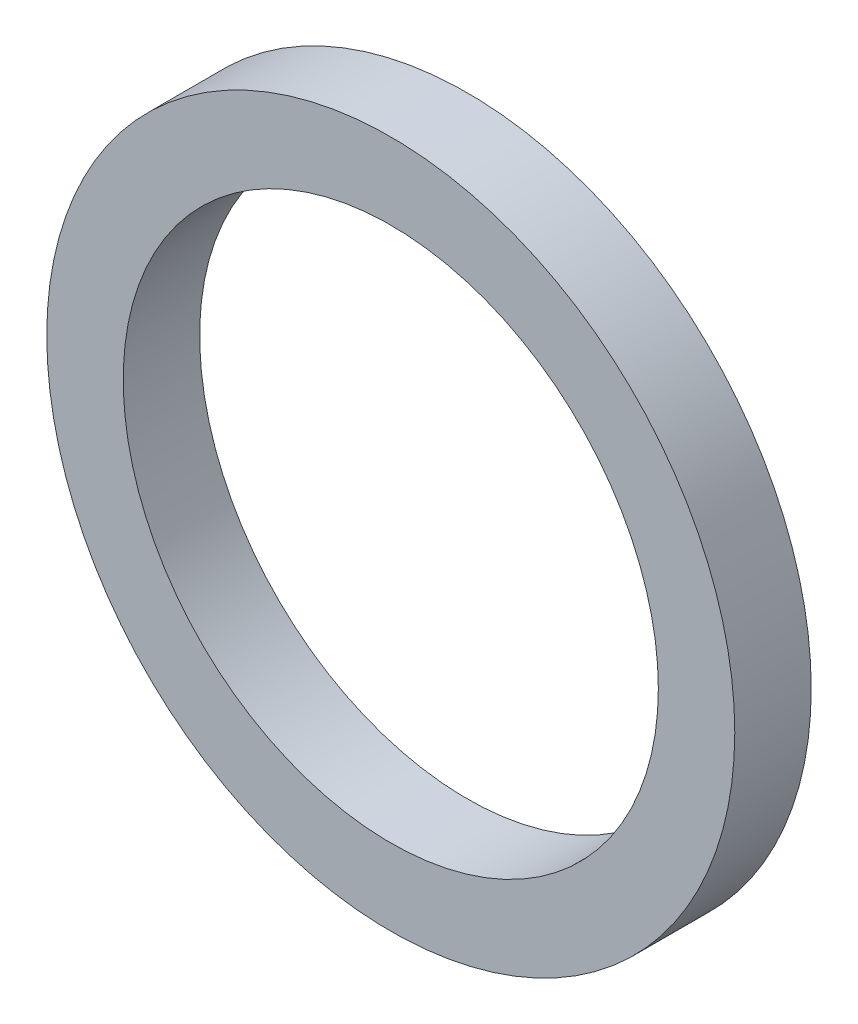
ISO-10303-21;
HEADER;
FILE_DESCRIPTION(('STEP AP214'),'2;1');
FILE_NAME('part.step','',(''),(''),'','','');
FILE_SCHEMA(('AUTOMOTIVE_DESIGN { 1 0 10303 214 1 1 1 1 }'));
ENDSEC;
DATA;
#1=APPLICATION_CONTEXT('core data for automotive mechanical design processes');
#2=APPLICATION_PROTOCOL_DEFINITION('international standard','automotive_design',2000,#1);
#3=PRODUCT_CONTEXT('',#1,'mechanical');
#4=PRODUCT('Part','Part','',(#3));
#5=PRODUCT_RELATED_PRODUCT_CATEGORY('part','',(#4));
#6=PRODUCT_DEFINITION_FORMATION('','',#4);
#7=PRODUCT_DEFINITION_CONTEXT('part definition',#1,'design');
#8=PRODUCT_DEFINITION('design','',#6,#7);
#9=PRODUCT_DEFINITION_SHAPE('','',#8);
#10=(LENGTH_UNIT() NAMED_UNIT(*) SI_UNIT(.MILLI.,.METRE.));
#11=(NAMED_UNIT(*) PLANE_ANGLE_UNIT() SI_UNIT($,.RADIAN.));
#12=(NAMED_UNIT(*) SI_UNIT($,.STERADIAN.) SOLID_ANGLE_UNIT());
#13=UNCERTAINTY_MEASURE_WITH_UNIT(LENGTH_MEASURE(1.E-05),#10,'distance_accuracy_value','');
#14=(GEOMETRIC_REPRESENTATION_CONTEXT(3) GLOBAL_UNCERTAINTY_ASSIGNED_CONTEXT((#13)) GLOBAL_UNIT_ASSIGNED_CONTEXT((#10,
#11,#12)) REPRESENTATION_CONTEXT('',''));
#15=CARTESIAN_POINT('',(0.,0.,0.));
#16=DIRECTION('',(0.,0.,1.));
#17=DIRECTION('',(1.,0.,0.));
#18=AXIS2_PLACEMENT_3D('',#15,#16,#17);
#19=CARTESIAN_POINT('',(0.,0.,10.));
#20=DIRECTION('',(0.,0.,1.));
#21=DIRECTION('',(1.,0.,0.));
#22=AXIS2_PLACEMENT_3D('',#19,#20,#21);
#23=PLANE('',#22);
#24=CARTESIAN_POINT('',(0.,0.,10.));
#25=DIRECTION('',(0.,0.,1.));
#26=DIRECTION('',(1.,0.,0.));
#27=AXIS2_PLACEMENT_3D('',#24,#25,#26);
#28=CIRCLE('',#27,45.);
#29=CARTESIAN_POINT('',(45.,0.,10.));
#30=VERTEX_POINT('',#29);
#31=EDGE_CURVE('E10',#30,#30,#28,.T.);
#32=ORIENTED_EDGE('',*,*,#31,.T.);
#33=EDGE_LOOP('',(#32));
#34=FACE_BOUND('',#33,.T.);
#35=CARTESIAN_POINT('',(0.,0.,10.));
#36=DIRECTION('',(0.,0.,1.));
#37=DIRECTION('',(1.,0.,0.));
#38=AXIS2_PLACEMENT_3D('',#35,#36,#37);
#39=CIRCLE('',#38,35.);
#40=CARTESIAN_POINT('',(35.,0.,10.));
#41=VERTEX_POINT('',#40);
#42=EDGE_CURVE('E50',#41,#41,#39,.T.);
#43=ORIENTED_EDGE('',*,*,#42,.F.);
#44=EDGE_LOOP('',(#43));
#45=FACE_BOUND('',#44,.T.);
#46=ADVANCED_FACE('F39',(#34,#45),#23,.T.);
#47=CARTESIAN_POINT('',(0.,0.,0.));
#48=DIRECTION('',(0.,0.,1.));
#49=DIRECTION('',(1.,0.,0.));
#50=AXIS2_PLACEMENT_3D('',#47,#48,#49);
#51=PLANE('',#50);
#52=CARTESIAN_POINT('',(0.,0.,0.));
#53=DIRECTION('',(0.,0.,1.));
#54=DIRECTION('',(1.,0.,0.));
#55=AXIS2_PLACEMENT_3D('',#52,#53,#54);
#56=CIRCLE('',#55,45.);
#57=CARTESIAN_POINT('',(45.,0.,0.));
#58=VERTEX_POINT('',#57);
#59=EDGE_CURVE('E43',#58,#58,#56,.T.);
#60=ORIENTED_EDGE('',*,*,#59,.F.);
#61=EDGE_LOOP('',(#60));
#62=FACE_BOUND('',#61,.T.);
#63=CARTESIAN_POINT('',(0.,0.,0.));
#64=DIRECTION('',(0.,0.,1.));
#65=DIRECTION('',(1.,0.,0.));
#66=AXIS2_PLACEMENT_3D('',#63,#64,#65);
#67=CIRCLE('',#66,35.);
#68=CARTESIAN_POINT('',(35.,0.,0.));
#69=VERTEX_POINT('',#68);
#70=EDGE_CURVE('E52',#69,#69,#67,.T.);
#71=ORIENTED_EDGE('',*,*,#70,.T.);
#72=EDGE_LOOP('',(#71));
#73=FACE_BOUND('',#72,.T.);
#74=ADVANCED_FACE('F62',(#62,#73),#51,.F.);
#75=CARTESIAN_POINT('',(0.,0.,10.));
#76=DIRECTION('',(0.,0.,-1.));
#77=DIRECTION('',(-1.,0.,0.));
#78=AXIS2_PLACEMENT_3D('',#75,#76,#77);
#79=CYLINDRICAL_SURFACE('',#78,45.);
#80=ORIENTED_EDGE('',*,*,#31,.F.);
#81=EDGE_LOOP('',(#80));
#82=FACE_BOUND('',#81,.T.);
#83=ORIENTED_EDGE('',*,*,#59,.T.);
#84=EDGE_LOOP('',(#83));
#85=FACE_BOUND('',#84,.T.);
#86=ADVANCED_FACE('F41',(#82,#85),#79,.T.);
#87=CARTESIAN_POINT('',(0.,0.,10.));
#88=DIRECTION('',(0.,0.,-1.));
#89=DIRECTION('',(-1.,0.,0.));
#90=AXIS2_PLACEMENT_3D('',#87,#88,#89);
#91=CYLINDRICAL_SURFACE('',#90,35.);
#92=ORIENTED_EDGE('',*,*,#42,.T.);
#93=EDGE_LOOP('',(#92));
#94=FACE_BOUND('',#93,.T.);
#95=ORIENTED_EDGE('',*,*,#70,.F.);
#96=EDGE_LOOP('',(#95));
#97=FACE_BOUND('',#96,.T.);
#98=ADVANCED_FACE('F58',(#94,#97),#91,.F.);
#99=CLOSED_SHELL('',(#46,#74,#86,#98));
#100=MANIFOLD_SOLID_BREP('B2',#99);
#101=ADVANCED_BREP_SHAPE_REPRESENTATION('',(#18,#100),#14);
#102=SHAPE_DEFINITION_REPRESENTATION(#9,#101);
ENDSEC;
END-ISO-10303-21;
